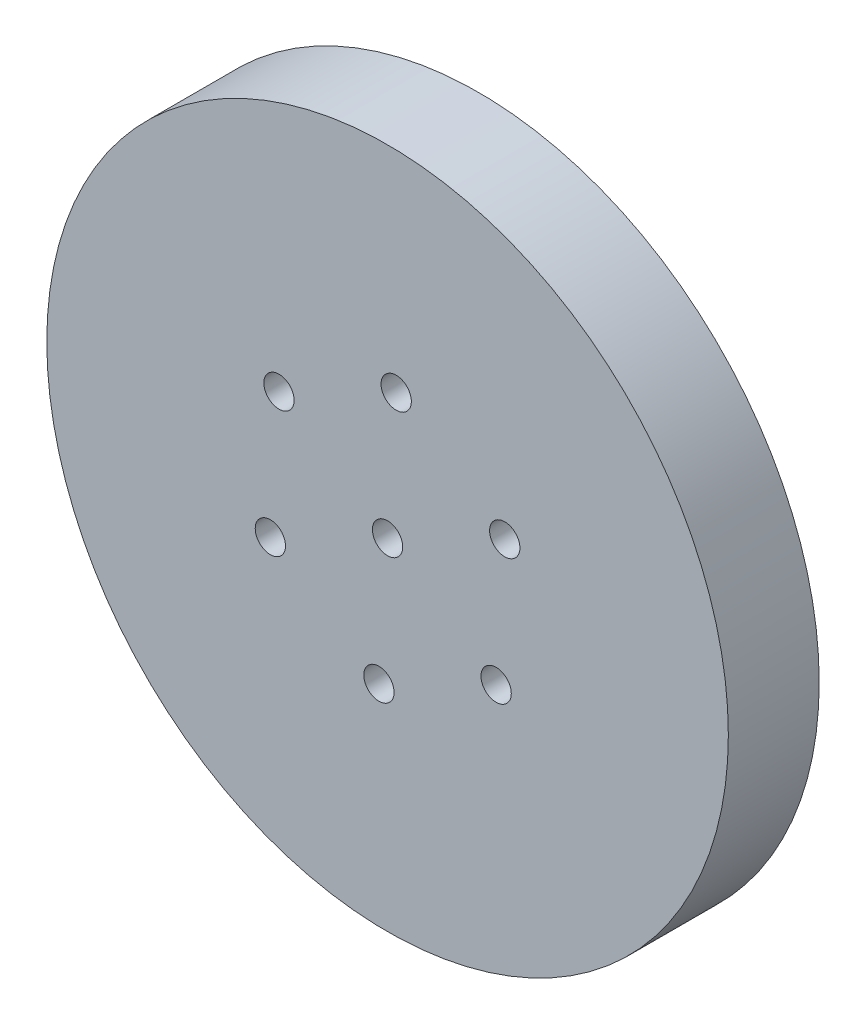
ISO-10303-21;
HEADER;
FILE_DESCRIPTION(('STEP AP214'),'2;1');
FILE_NAME('part.step','',(''),(''),'','','');
FILE_SCHEMA(('AUTOMOTIVE_DESIGN { 1 0 10303 214 1 1 1 1 }'));
ENDSEC;
DATA;
#1=APPLICATION_CONTEXT('core data for automotive mechanical design processes');
#2=APPLICATION_PROTOCOL_DEFINITION('international standard','automotive_design',2000,#1);
#3=PRODUCT_CONTEXT('',#1,'mechanical');
#4=PRODUCT('Part','Part','',(#3));
#5=PRODUCT_RELATED_PRODUCT_CATEGORY('part','',(#4));
#6=PRODUCT_DEFINITION_FORMATION('','',#4);
#7=PRODUCT_DEFINITION_CONTEXT('part definition',#1,'design');
#8=PRODUCT_DEFINITION('design','',#6,#7);
#9=PRODUCT_DEFINITION_SHAPE('','',#8);
#10=(LENGTH_UNIT() NAMED_UNIT(*) SI_UNIT(.MILLI.,.METRE.));
#11=(NAMED_UNIT(*) PLANE_ANGLE_UNIT() SI_UNIT($,.RADIAN.));
#12=(NAMED_UNIT(*) SI_UNIT($,.STERADIAN.) SOLID_ANGLE_UNIT());
#13=UNCERTAINTY_MEASURE_WITH_UNIT(LENGTH_MEASURE(1.E-05),#10,'distance_accuracy_value','');
#14=(GEOMETRIC_REPRESENTATION_CONTEXT(3) GLOBAL_UNCERTAINTY_ASSIGNED_CONTEXT((#13)) GLOBAL_UNIT_ASSIGNED_CONTEXT((#10,
#11,#12)) REPRESENTATION_CONTEXT('',''));
#15=CARTESIAN_POINT('',(0.,0.,0.));
#16=DIRECTION('',(0.,0.,1.));
#17=DIRECTION('',(1.,0.,0.));
#18=AXIS2_PLACEMENT_3D('',#15,#16,#17);
#19=CARTESIAN_POINT('',(0.,0.,12.));
#20=DIRECTION('',(0.,0.,-1.));
#21=DIRECTION('',(-1.,0.,0.));
#22=AXIS2_PLACEMENT_3D('',#19,#20,#21);
#23=CYLINDRICAL_SURFACE('',#22,45.);
#24=CARTESIAN_POINT('',(0.,0.,12.));
#25=DIRECTION('',(0.,0.,1.));
#26=DIRECTION('',(1.,0.,0.));
#27=AXIS2_PLACEMENT_3D('',#24,#25,#26);
#28=CIRCLE('',#27,45.);
#29=CARTESIAN_POINT('',(45.,0.,12.));
#30=VERTEX_POINT('',#29);
#31=EDGE_CURVE('E10',#30,#30,#28,.T.);
#32=ORIENTED_EDGE('',*,*,#31,.F.);
#33=EDGE_LOOP('',(#32));
#34=FACE_BOUND('',#33,.T.);
#35=CARTESIAN_POINT('',(0.,0.,0.));
#36=DIRECTION('',(0.,0.,1.));
#37=DIRECTION('',(1.,0.,0.));
#38=AXIS2_PLACEMENT_3D('',#35,#36,#37);
#39=CIRCLE('',#38,45.);
#40=CARTESIAN_POINT('',(45.,0.,0.));
#41=VERTEX_POINT('',#40);
#42=EDGE_CURVE('E40',#41,#41,#39,.T.);
#43=ORIENTED_EDGE('',*,*,#42,.T.);
#44=EDGE_LOOP('',(#43));
#45=FACE_BOUND('',#44,.T.);
#46=ADVANCED_FACE('F37',(#34,#45),#23,.T.);
#47=CARTESIAN_POINT('',(0.,0.,12.));
#48=DIRECTION('',(0.,0.,1.));
#49=DIRECTION('',(1.,0.,0.));
#50=AXIS2_PLACEMENT_3D('',#47,#48,#49);
#51=PLANE('',#50);
#52=CARTESIAN_POINT('',(0.,0.,12.));
#53=DIRECTION('',(0.,0.,1.));
#54=DIRECTION('',(1.,0.,0.));
#55=AXIS2_PLACEMENT_3D('',#52,#53,#54);
#56=CIRCLE('',#55,2.);
#57=CARTESIAN_POINT('',(2.,0.,12.));
#58=VERTEX_POINT('',#57);
#59=EDGE_CURVE('E74',#58,#58,#56,.T.);
#60=ORIENTED_EDGE('',*,*,#59,.F.);
#61=EDGE_LOOP('',(#60));
#62=FACE_BOUND('',#61,.T.);
#63=CARTESIAN_POINT('',(14.3363111929717,-9.59336652996607,12.));
#64=DIRECTION('',(0.,0.,1.));
#65=DIRECTION('',(1.,0.,0.));
#66=AXIS2_PLACEMENT_3D('',#63,#64,#65);
#67=CIRCLE('',#66,2.);
#68=CARTESIAN_POINT('',(16.3363111929717,-9.59336652996607,12.));
#69=VERTEX_POINT('',#68);
#70=EDGE_CURVE('E47',#69,#69,#67,.T.);
#71=ORIENTED_EDGE('',*,*,#70,.F.);
#72=EDGE_LOOP('',(#71));
#73=FACE_BOUND('',#72,.T.);
#74=CARTESIAN_POINT('',(-1.13994352628015,-17.2122929546557,12.));
#75=DIRECTION('',(0.,0.,1.));
#76=DIRECTION('',(1.,0.,0.));
#77=AXIS2_PLACEMENT_3D('',#74,#75,#76);
#78=CIRCLE('',#77,2.);
#79=CARTESIAN_POINT('',(0.860056473719854,-17.2122929546557,12.));
#80=VERTEX_POINT('',#79);
#81=EDGE_CURVE('E51',#80,#80,#78,.T.);
#82=ORIENTED_EDGE('',*,*,#81,.F.);
#83=EDGE_LOOP('',(#82));
#84=FACE_BOUND('',#83,.T.);
#85=CARTESIAN_POINT('',(-15.4762547192519,-7.61892642468962,12.));
#86=DIRECTION('',(0.,0.,1.));
#87=DIRECTION('',(1.,0.,0.));
#88=AXIS2_PLACEMENT_3D('',#85,#86,#87);
#89=CIRCLE('',#88,2.);
#90=CARTESIAN_POINT('',(-13.4762547192519,-7.61892642468962,12.));
#91=VERTEX_POINT('',#90);
#92=EDGE_CURVE('E54',#91,#91,#89,.T.);
#93=ORIENTED_EDGE('',*,*,#92,.F.);
#94=EDGE_LOOP('',(#93));
#95=FACE_BOUND('',#94,.T.);
#96=CARTESIAN_POINT('',(-14.3363111929717,9.59336652996616,12.));
#97=DIRECTION('',(0.,0.,1.));
#98=DIRECTION('',(1.,0.,0.));
#99=AXIS2_PLACEMENT_3D('',#96,#97,#98);
#100=CIRCLE('',#99,2.);
#101=CARTESIAN_POINT('',(-12.3363111929717,9.59336652996616,12.));
#102=VERTEX_POINT('',#101);
#103=EDGE_CURVE('E57',#102,#102,#100,.T.);
#104=ORIENTED_EDGE('',*,*,#103,.F.);
#105=EDGE_LOOP('',(#104));
#106=FACE_BOUND('',#105,.T.);
#107=CARTESIAN_POINT('',(1.13994352628027,17.2122929546557,12.));
#108=DIRECTION('',(0.,0.,1.));
#109=DIRECTION('',(1.,0.,0.));
#110=AXIS2_PLACEMENT_3D('',#107,#108,#109);
#111=CIRCLE('',#110,2.);
#112=CARTESIAN_POINT('',(3.13994352628027,17.2122929546557,12.));
#113=VERTEX_POINT('',#112);
#114=EDGE_CURVE('E60',#113,#113,#111,.T.);
#115=ORIENTED_EDGE('',*,*,#114,.F.);
#116=EDGE_LOOP('',(#115));
#117=FACE_BOUND('',#116,.T.);
#118=CARTESIAN_POINT('',(15.4762547192519,7.61892642468951,12.));
#119=DIRECTION('',(0.,0.,1.));
#120=DIRECTION('',(1.,0.,0.));
#121=AXIS2_PLACEMENT_3D('',#118,#119,#120);
#122=CIRCLE('',#121,2.);
#123=CARTESIAN_POINT('',(17.4762547192519,7.61892642468951,12.));
#124=VERTEX_POINT('',#123);
#125=EDGE_CURVE('E63',#124,#124,#122,.T.);
#126=ORIENTED_EDGE('',*,*,#125,.F.);
#127=EDGE_LOOP('',(#126));
#128=FACE_BOUND('',#127,.T.);
#129=ORIENTED_EDGE('',*,*,#31,.T.);
#130=EDGE_LOOP('',(#129));
#131=FACE_BOUND('',#130,.T.);
#132=ADVANCED_FACE('F97',(#62,#73,#84,#95,#106,#117,#128,#131),#51,.T.);
#133=CARTESIAN_POINT('',(0.,0.,0.));
#134=DIRECTION('',(0.,0.,1.));
#135=DIRECTION('',(1.,0.,0.));
#136=AXIS2_PLACEMENT_3D('',#133,#134,#135);
#137=PLANE('',#136);
#138=CARTESIAN_POINT('',(0.,0.,0.));
#139=DIRECTION('',(0.,0.,-1.));
#140=DIRECTION('',(-1.,0.,0.));
#141=AXIS2_PLACEMENT_3D('',#138,#139,#140);
#142=CIRCLE('',#141,2.);
#143=CARTESIAN_POINT('',(-2.,0.,0.));
#144=VERTEX_POINT('',#143);
#145=EDGE_CURVE('E87',#144,#144,#142,.T.);
#146=ORIENTED_EDGE('',*,*,#145,.F.);
#147=EDGE_LOOP('',(#146));
#148=FACE_BOUND('',#147,.T.);
#149=CARTESIAN_POINT('',(14.3363111929717,-9.59336652996607,0.));
#150=DIRECTION('',(0.,0.,-1.));
#151=DIRECTION('',(-1.,0.,0.));
#152=AXIS2_PLACEMENT_3D('',#149,#150,#151);
#153=CIRCLE('',#152,2.);
#154=CARTESIAN_POINT('',(12.3363111929717,-9.59336652996607,0.));
#155=VERTEX_POINT('',#154);
#156=EDGE_CURVE('E70',#155,#155,#153,.T.);
#157=ORIENTED_EDGE('',*,*,#156,.F.);
#158=EDGE_LOOP('',(#157));
#159=FACE_BOUND('',#158,.T.);
#160=CARTESIAN_POINT('',(-1.13994352628015,-17.2122929546557,0.));
#161=DIRECTION('',(0.,0.,-1.));
#162=DIRECTION('',(-1.,0.,0.));
#163=AXIS2_PLACEMENT_3D('',#160,#161,#162);
#164=CIRCLE('',#163,2.);
#165=CARTESIAN_POINT('',(-3.13994352628015,-17.2122929546557,0.));
#166=VERTEX_POINT('',#165);
#167=EDGE_CURVE('E73',#166,#166,#164,.T.);
#168=ORIENTED_EDGE('',*,*,#167,.F.);
#169=EDGE_LOOP('',(#168));
#170=FACE_BOUND('',#169,.T.);
#171=CARTESIAN_POINT('',(-15.4762547192519,-7.61892642468962,0.));
#172=DIRECTION('',(0.,0.,-1.));
#173=DIRECTION('',(-1.,0.,0.));
#174=AXIS2_PLACEMENT_3D('',#171,#172,#173);
#175=CIRCLE('',#174,2.);
#176=CARTESIAN_POINT('',(-17.4762547192519,-7.61892642468962,0.));
#177=VERTEX_POINT('',#176);
#178=EDGE_CURVE('E77',#177,#177,#175,.T.);
#179=ORIENTED_EDGE('',*,*,#178,.F.);
#180=EDGE_LOOP('',(#179));
#181=FACE_BOUND('',#180,.T.);
#182=CARTESIAN_POINT('',(-14.3363111929717,9.59336652996616,0.));
#183=DIRECTION('',(0.,0.,-1.));
#184=DIRECTION('',(-1.,0.,0.));
#185=AXIS2_PLACEMENT_3D('',#182,#183,#184);
#186=CIRCLE('',#185,2.);
#187=CARTESIAN_POINT('',(-16.3363111929717,9.59336652996616,0.));
#188=VERTEX_POINT('',#187);
#189=EDGE_CURVE('E80',#188,#188,#186,.T.);
#190=ORIENTED_EDGE('',*,*,#189,.F.);
#191=EDGE_LOOP('',(#190));
#192=FACE_BOUND('',#191,.T.);
#193=CARTESIAN_POINT('',(1.13994352628027,17.2122929546557,0.));
#194=DIRECTION('',(0.,0.,-1.));
#195=DIRECTION('',(-1.,0.,0.));
#196=AXIS2_PLACEMENT_3D('',#193,#194,#195);
#197=CIRCLE('',#196,2.);
#198=CARTESIAN_POINT('',(-0.860056473719732,17.2122929546557,0.));
#199=VERTEX_POINT('',#198);
#200=EDGE_CURVE('E69',#199,#199,#197,.T.);
#201=ORIENTED_EDGE('',*,*,#200,.F.);
#202=EDGE_LOOP('',(#201));
#203=FACE_BOUND('',#202,.T.);
#204=CARTESIAN_POINT('',(15.4762547192519,7.61892642468951,0.));
#205=DIRECTION('',(0.,0.,-1.));
#206=DIRECTION('',(-1.,0.,0.));
#207=AXIS2_PLACEMENT_3D('',#204,#205,#206);
#208=CIRCLE('',#207,2.);
#209=CARTESIAN_POINT('',(13.4762547192519,7.61892642468951,0.));
#210=VERTEX_POINT('',#209);
#211=EDGE_CURVE('E66',#210,#210,#208,.T.);
#212=ORIENTED_EDGE('',*,*,#211,.F.);
#213=EDGE_LOOP('',(#212));
#214=FACE_BOUND('',#213,.T.);
#215=ORIENTED_EDGE('',*,*,#42,.F.);
#216=EDGE_LOOP('',(#215));
#217=FACE_BOUND('',#216,.T.);
#218=ADVANCED_FACE('F93',(#148,#159,#170,#181,#192,#203,#214,#217),#137,.F.);
#219=CARTESIAN_POINT('',(15.4762547192519,7.61892642468951,20.));
#220=DIRECTION('',(0.,0.,-1.));
#221=DIRECTION('',(-1.,0.,0.));
#222=AXIS2_PLACEMENT_3D('',#219,#220,#221);
#223=CYLINDRICAL_SURFACE('',#222,2.);
#224=ORIENTED_EDGE('',*,*,#125,.T.);
#225=EDGE_LOOP('',(#224));
#226=FACE_BOUND('',#225,.T.);
#227=ORIENTED_EDGE('',*,*,#211,.T.);
#228=EDGE_LOOP('',(#227));
#229=FACE_BOUND('',#228,.T.);
#230=ADVANCED_FACE('F96',(#226,#229),#223,.F.);
#231=CARTESIAN_POINT('',(1.13994352628027,17.2122929546557,20.));
#232=DIRECTION('',(0.,0.,-1.));
#233=DIRECTION('',(-1.,0.,0.));
#234=AXIS2_PLACEMENT_3D('',#231,#232,#233);
#235=CYLINDRICAL_SURFACE('',#234,2.);
#236=ORIENTED_EDGE('',*,*,#114,.T.);
#237=EDGE_LOOP('',(#236));
#238=FACE_BOUND('',#237,.T.);
#239=ORIENTED_EDGE('',*,*,#200,.T.);
#240=EDGE_LOOP('',(#239));
#241=FACE_BOUND('',#240,.T.);
#242=ADVANCED_FACE('F127',(#238,#241),#235,.F.);
#243=CARTESIAN_POINT('',(-14.3363111929717,9.59336652996616,20.));
#244=DIRECTION('',(0.,0.,-1.));
#245=DIRECTION('',(-1.,0.,0.));
#246=AXIS2_PLACEMENT_3D('',#243,#244,#245);
#247=CYLINDRICAL_SURFACE('',#246,2.);
#248=ORIENTED_EDGE('',*,*,#103,.T.);
#249=EDGE_LOOP('',(#248));
#250=FACE_BOUND('',#249,.T.);
#251=ORIENTED_EDGE('',*,*,#189,.T.);
#252=EDGE_LOOP('',(#251));
#253=FACE_BOUND('',#252,.T.);
#254=ADVANCED_FACE('F139',(#250,#253),#247,.F.);
#255=CARTESIAN_POINT('',(-15.4762547192519,-7.61892642468962,20.));
#256=DIRECTION('',(0.,0.,-1.));
#257=DIRECTION('',(-1.,0.,0.));
#258=AXIS2_PLACEMENT_3D('',#255,#256,#257);
#259=CYLINDRICAL_SURFACE('',#258,2.);
#260=ORIENTED_EDGE('',*,*,#92,.T.);
#261=EDGE_LOOP('',(#260));
#262=FACE_BOUND('',#261,.T.);
#263=ORIENTED_EDGE('',*,*,#178,.T.);
#264=EDGE_LOOP('',(#263));
#265=FACE_BOUND('',#264,.T.);
#266=ADVANCED_FACE('F135',(#262,#265),#259,.F.);
#267=CARTESIAN_POINT('',(-1.13994352628015,-17.2122929546557,20.));
#268=DIRECTION('',(0.,0.,-1.));
#269=DIRECTION('',(-1.,0.,0.));
#270=AXIS2_PLACEMENT_3D('',#267,#268,#269);
#271=CYLINDRICAL_SURFACE('',#270,2.);
#272=ORIENTED_EDGE('',*,*,#81,.T.);
#273=EDGE_LOOP('',(#272));
#274=FACE_BOUND('',#273,.T.);
#275=ORIENTED_EDGE('',*,*,#167,.T.);
#276=EDGE_LOOP('',(#275));
#277=FACE_BOUND('',#276,.T.);
#278=ADVANCED_FACE('F131',(#274,#277),#271,.F.);
#279=CARTESIAN_POINT('',(14.3363111929717,-9.59336652996607,20.));
#280=DIRECTION('',(0.,0.,-1.));
#281=DIRECTION('',(-1.,0.,0.));
#282=AXIS2_PLACEMENT_3D('',#279,#280,#281);
#283=CYLINDRICAL_SURFACE('',#282,2.);
#284=ORIENTED_EDGE('',*,*,#70,.T.);
#285=EDGE_LOOP('',(#284));
#286=FACE_BOUND('',#285,.T.);
#287=ORIENTED_EDGE('',*,*,#156,.T.);
#288=EDGE_LOOP('',(#287));
#289=FACE_BOUND('',#288,.T.);
#290=ADVANCED_FACE('F129',(#286,#289),#283,.F.);
#291=CARTESIAN_POINT('',(0.,0.,21.));
#292=DIRECTION('',(0.,0.,-1.));
#293=DIRECTION('',(-1.,0.,0.));
#294=AXIS2_PLACEMENT_3D('',#291,#292,#293);
#295=CYLINDRICAL_SURFACE('',#294,2.);
#296=ORIENTED_EDGE('',*,*,#59,.T.);
#297=EDGE_LOOP('',(#296));
#298=FACE_BOUND('',#297,.T.);
#299=ORIENTED_EDGE('',*,*,#145,.T.);
#300=EDGE_LOOP('',(#299));
#301=FACE_BOUND('',#300,.T.);
#302=ADVANCED_FACE('F91',(#298,#301),#295,.F.);
#303=CLOSED_SHELL('',(#46,#132,#218,#230,#242,#254,#266,#278,#290,#302));
#304=MANIFOLD_SOLID_BREP('B2',#303);
#305=ADVANCED_BREP_SHAPE_REPRESENTATION('',(#18,#304),#14);
#306=SHAPE_DEFINITION_REPRESENTATION(#9,#305);
ENDSEC;
END-ISO-10303-21;
